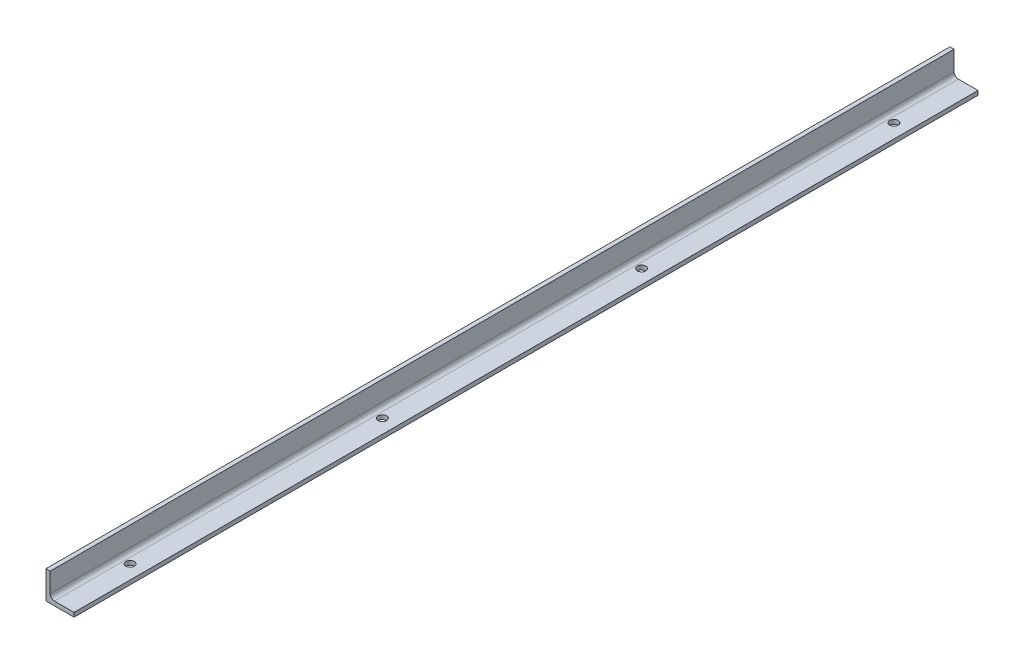
ISO-10303-21;
HEADER;
FILE_DESCRIPTION(('STEP AP214'),'2;1');
FILE_NAME('part.step','',(''),(''),'','','');
FILE_SCHEMA(('AUTOMOTIVE_DESIGN { 1 0 10303 214 1 1 1 1 }'));
ENDSEC;
DATA;
#1=APPLICATION_CONTEXT('core data for automotive mechanical design processes');
#2=APPLICATION_PROTOCOL_DEFINITION('international standard','automotive_design',2000,#1);
#3=PRODUCT_CONTEXT('',#1,'mechanical');
#4=PRODUCT('Part','Part','',(#3));
#5=PRODUCT_RELATED_PRODUCT_CATEGORY('part','',(#4));
#6=PRODUCT_DEFINITION_FORMATION('','',#4);
#7=PRODUCT_DEFINITION_CONTEXT('part definition',#1,'design');
#8=PRODUCT_DEFINITION('design','',#6,#7);
#9=PRODUCT_DEFINITION_SHAPE('','',#8);
#10=(LENGTH_UNIT() NAMED_UNIT(*) SI_UNIT(.MILLI.,.METRE.));
#11=(NAMED_UNIT(*) PLANE_ANGLE_UNIT() SI_UNIT($,.RADIAN.));
#12=(NAMED_UNIT(*) SI_UNIT($,.STERADIAN.) SOLID_ANGLE_UNIT());
#13=UNCERTAINTY_MEASURE_WITH_UNIT(LENGTH_MEASURE(1.E-05),#10,'distance_accuracy_value','');
#14=(GEOMETRIC_REPRESENTATION_CONTEXT(3) GLOBAL_UNCERTAINTY_ASSIGNED_CONTEXT((#13)) GLOBAL_UNIT_ASSIGNED_CONTEXT((#10,
#11,#12)) REPRESENTATION_CONTEXT('',''));
#15=CARTESIAN_POINT('',(0.,0.,0.));
#16=DIRECTION('',(0.,0.,1.));
#17=DIRECTION('',(1.,0.,0.));
#18=AXIS2_PLACEMENT_3D('',#15,#16,#17);
#19=CARTESIAN_POINT('',(20.,0.,645.));
#20=DIRECTION('',(0.,1.,0.));
#21=DIRECTION('',(-1.,0.,0.));
#22=AXIS2_PLACEMENT_3D('',#19,#20,#21);
#23=PLANE('',#22);
#24=CARTESIAN_POINT('',(10.,0.,595.));
#25=DIRECTION('',(0.,-1.,0.));
#26=DIRECTION('',(1.,0.,0.));
#27=AXIS2_PLACEMENT_3D('',#24,#25,#26);
#28=CIRCLE('',#27,3.);
#29=CARTESIAN_POINT('',(13.,0.,595.));
#30=VERTEX_POINT('',#29);
#31=EDGE_CURVE('E152',#30,#30,#28,.T.);
#32=ORIENTED_EDGE('',*,*,#31,.F.);
#33=EDGE_LOOP('',(#32));
#34=FACE_BOUND('',#33,.T.);
#35=CARTESIAN_POINT('',(10.,0.,230.));
#36=DIRECTION('',(0.,-1.,0.));
#37=DIRECTION('',(1.,0.,0.));
#38=AXIS2_PLACEMENT_3D('',#35,#36,#37);
#39=CIRCLE('',#38,3.);
#40=CARTESIAN_POINT('',(13.,0.,230.));
#41=VERTEX_POINT('',#40);
#42=EDGE_CURVE('E208',#41,#41,#39,.T.);
#43=ORIENTED_EDGE('',*,*,#42,.F.);
#44=EDGE_LOOP('',(#43));
#45=FACE_BOUND('',#44,.T.);
#46=CARTESIAN_POINT('',(10.,0.,415.));
#47=DIRECTION('',(0.,-1.,0.));
#48=DIRECTION('',(1.,0.,0.));
#49=AXIS2_PLACEMENT_3D('',#46,#47,#48);
#50=CIRCLE('',#49,3.);
#51=CARTESIAN_POINT('',(13.,0.,415.));
#52=VERTEX_POINT('',#51);
#53=EDGE_CURVE('E165',#52,#52,#50,.T.);
#54=ORIENTED_EDGE('',*,*,#53,.F.);
#55=EDGE_LOOP('',(#54));
#56=FACE_BOUND('',#55,.T.);
#57=CARTESIAN_POINT('',(10.,0.,50.));
#58=DIRECTION('',(0.,-1.,0.));
#59=DIRECTION('',(1.,0.,0.));
#60=AXIS2_PLACEMENT_3D('',#57,#58,#59);
#61=CIRCLE('',#60,3.);
#62=CARTESIAN_POINT('',(13.,0.,50.));
#63=VERTEX_POINT('',#62);
#64=EDGE_CURVE('E148',#63,#63,#61,.T.);
#65=ORIENTED_EDGE('',*,*,#64,.F.);
#66=EDGE_LOOP('',(#65));
#67=FACE_BOUND('',#66,.T.);
#68=DIRECTION('',(1.,0.,0.));
#69=VECTOR('',#68,1.);
#70=CARTESIAN_POINT('',(20.,0.,0.));
#71=LINE('',#70,#69);
#72=CARTESIAN_POINT('',(0.,0.,0.));
#73=VERTEX_POINT('',#72);
#74=CARTESIAN_POINT('',(20.,0.,0.));
#75=VERTEX_POINT('',#74);
#76=EDGE_CURVE('E124',#73,#75,#71,.T.);
#77=ORIENTED_EDGE('',*,*,#76,.T.);
#78=DIRECTION('',(0.,0.,-1.));
#79=VECTOR('',#78,1.);
#80=CARTESIAN_POINT('',(20.,0.,645.));
#81=LINE('',#80,#79);
#82=CARTESIAN_POINT('',(20.,0.,645.));
#83=VERTEX_POINT('',#82);
#84=EDGE_CURVE('E11',#83,#75,#81,.T.);
#85=ORIENTED_EDGE('',*,*,#84,.F.);
#86=DIRECTION('',(1.,0.,0.));
#87=VECTOR('',#86,1.);
#88=CARTESIAN_POINT('',(20.,0.,645.));
#89=LINE('',#88,#87);
#90=CARTESIAN_POINT('',(0.,0.,645.));
#91=VERTEX_POINT('',#90);
#92=EDGE_CURVE('E137',#91,#83,#89,.T.);
#93=ORIENTED_EDGE('',*,*,#92,.F.);
#94=DIRECTION('',(0.,0.,-1.));
#95=VECTOR('',#94,1.);
#96=CARTESIAN_POINT('',(0.,0.,645.));
#97=LINE('',#96,#95);
#98=EDGE_CURVE('E120',#91,#73,#97,.T.);
#99=ORIENTED_EDGE('',*,*,#98,.T.);
#100=EDGE_LOOP('',(#77,#85,#93,#99));
#101=FACE_BOUND('',#100,.T.);
#102=ADVANCED_FACE('F32',(#34,#45,#56,#67,#101),#23,.F.);
#103=CARTESIAN_POINT('',(20.,3.,645.));
#104=DIRECTION('',(-1.,0.,0.));
#105=DIRECTION('',(0.,0.,1.));
#106=AXIS2_PLACEMENT_3D('',#103,#104,#105);
#107=PLANE('',#106);
#108=DIRECTION('',(0.,1.,0.));
#109=VECTOR('',#108,1.);
#110=CARTESIAN_POINT('',(20.,3.,0.));
#111=LINE('',#110,#109);
#112=CARTESIAN_POINT('',(20.,3.,0.));
#113=VERTEX_POINT('',#112);
#114=EDGE_CURVE('E127',#75,#113,#111,.T.);
#115=ORIENTED_EDGE('',*,*,#114,.T.);
#116=DIRECTION('',(0.,0.,-1.));
#117=VECTOR('',#116,1.);
#118=CARTESIAN_POINT('',(20.,3.,645.));
#119=LINE('',#118,#117);
#120=CARTESIAN_POINT('',(20.,3.,645.));
#121=VERTEX_POINT('',#120);
#122=EDGE_CURVE('E41',#121,#113,#119,.T.);
#123=ORIENTED_EDGE('',*,*,#122,.F.);
#124=DIRECTION('',(0.,1.,0.));
#125=VECTOR('',#124,1.);
#126=CARTESIAN_POINT('',(20.,3.,645.));
#127=LINE('',#126,#125);
#128=EDGE_CURVE('E90',#83,#121,#127,.T.);
#129=ORIENTED_EDGE('',*,*,#128,.F.);
#130=ORIENTED_EDGE('',*,*,#84,.T.);
#131=EDGE_LOOP('',(#115,#123,#129,#130));
#132=FACE_BOUND('',#131,.T.);
#133=ADVANCED_FACE('F195',(#132),#107,.F.);
#134=CARTESIAN_POINT('',(6.00000000000002,3.,645.));
#135=DIRECTION('',(0.,-1.,0.));
#136=DIRECTION('',(1.,0.,0.));
#137=AXIS2_PLACEMENT_3D('',#134,#135,#136);
#138=PLANE('',#137);
#139=CARTESIAN_POINT('',(10.,3.,595.));
#140=DIRECTION('',(0.,-1.,0.));
#141=DIRECTION('',(1.,0.,0.));
#142=AXIS2_PLACEMENT_3D('',#139,#140,#141);
#143=CIRCLE('',#142,3.);
#144=CARTESIAN_POINT('',(13.,3.,595.));
#145=VERTEX_POINT('',#144);
#146=EDGE_CURVE('E35',#145,#145,#143,.T.);
#147=ORIENTED_EDGE('',*,*,#146,.T.);
#148=EDGE_LOOP('',(#147));
#149=FACE_BOUND('',#148,.T.);
#150=CARTESIAN_POINT('',(10.,3.,230.));
#151=DIRECTION('',(0.,-1.,0.));
#152=DIRECTION('',(1.,0.,0.));
#153=AXIS2_PLACEMENT_3D('',#150,#151,#152);
#154=CIRCLE('',#153,3.);
#155=CARTESIAN_POINT('',(13.,3.,230.));
#156=VERTEX_POINT('',#155);
#157=EDGE_CURVE('E151',#156,#156,#154,.T.);
#158=ORIENTED_EDGE('',*,*,#157,.T.);
#159=EDGE_LOOP('',(#158));
#160=FACE_BOUND('',#159,.T.);
#161=CARTESIAN_POINT('',(10.,3.,415.));
#162=DIRECTION('',(0.,-1.,0.));
#163=DIRECTION('',(1.,0.,0.));
#164=AXIS2_PLACEMENT_3D('',#161,#162,#163);
#165=CIRCLE('',#164,3.);
#166=CARTESIAN_POINT('',(13.,3.,415.));
#167=VERTEX_POINT('',#166);
#168=EDGE_CURVE('E149',#167,#167,#165,.T.);
#169=ORIENTED_EDGE('',*,*,#168,.T.);
#170=EDGE_LOOP('',(#169));
#171=FACE_BOUND('',#170,.T.);
#172=CARTESIAN_POINT('',(10.,3.,50.));
#173=DIRECTION('',(0.,-1.,0.));
#174=DIRECTION('',(1.,0.,0.));
#175=AXIS2_PLACEMENT_3D('',#172,#173,#174);
#176=CIRCLE('',#175,3.);
#177=CARTESIAN_POINT('',(13.,3.,50.));
#178=VERTEX_POINT('',#177);
#179=EDGE_CURVE('E128',#178,#178,#176,.T.);
#180=ORIENTED_EDGE('',*,*,#179,.T.);
#181=EDGE_LOOP('',(#180));
#182=FACE_BOUND('',#181,.T.);
#183=DIRECTION('',(-1.,0.,0.));
#184=VECTOR('',#183,1.);
#185=CARTESIAN_POINT('',(6.00000000000002,3.,0.));
#186=LINE('',#185,#184);
#187=CARTESIAN_POINT('',(6.00000000000002,3.,0.));
#188=VERTEX_POINT('',#187);
#189=EDGE_CURVE('E130',#113,#188,#186,.T.);
#190=ORIENTED_EDGE('',*,*,#189,.T.);
#191=DIRECTION('',(0.,0.,-1.));
#192=VECTOR('',#191,1.);
#193=CARTESIAN_POINT('',(6.00000000000002,3.,645.));
#194=LINE('',#193,#192);
#195=CARTESIAN_POINT('',(6.00000000000002,3.,645.));
#196=VERTEX_POINT('',#195);
#197=EDGE_CURVE('E141',#196,#188,#194,.T.);
#198=ORIENTED_EDGE('',*,*,#197,.F.);
#199=DIRECTION('',(-1.,0.,0.));
#200=VECTOR('',#199,1.);
#201=CARTESIAN_POINT('',(6.00000000000002,3.,645.));
#202=LINE('',#201,#200);
#203=EDGE_CURVE('E169',#121,#196,#202,.T.);
#204=ORIENTED_EDGE('',*,*,#203,.F.);
#205=ORIENTED_EDGE('',*,*,#122,.T.);
#206=EDGE_LOOP('',(#190,#198,#204,#205));
#207=FACE_BOUND('',#206,.T.);
#208=ADVANCED_FACE('F173',(#149,#160,#171,#182,#207),#138,.F.);
#209=CARTESIAN_POINT('',(6.,6.,645.));
#210=DIRECTION('',(0.,0.,-1.));
#211=DIRECTION('',(-1.,0.,0.));
#212=AXIS2_PLACEMENT_3D('',#209,#210,#211);
#213=CYLINDRICAL_SURFACE('',#212,3.);
#214=CARTESIAN_POINT('',(6.,6.,0.));
#215=DIRECTION('',(0.,0.,-1.));
#216=DIRECTION('',(1.,0.,0.));
#217=AXIS2_PLACEMENT_3D('',#214,#215,#216);
#218=CIRCLE('',#217,3.);
#219=CARTESIAN_POINT('',(3.,6.00000000000002,0.));
#220=VERTEX_POINT('',#219);
#221=EDGE_CURVE('E132',#188,#220,#218,.T.);
#222=ORIENTED_EDGE('',*,*,#221,.T.);
#223=DIRECTION('',(0.,0.,-1.));
#224=VECTOR('',#223,1.);
#225=CARTESIAN_POINT('',(3.,6.00000000000002,645.));
#226=LINE('',#225,#224);
#227=CARTESIAN_POINT('',(3.,6.00000000000002,645.));
#228=VERTEX_POINT('',#227);
#229=EDGE_CURVE('E115',#228,#220,#226,.T.);
#230=ORIENTED_EDGE('',*,*,#229,.F.);
#231=CARTESIAN_POINT('',(6.,6.,645.));
#232=DIRECTION('',(0.,0.,-1.));
#233=DIRECTION('',(1.,0.,0.));
#234=AXIS2_PLACEMENT_3D('',#231,#232,#233);
#235=CIRCLE('',#234,3.);
#236=EDGE_CURVE('E106',#196,#228,#235,.T.);
#237=ORIENTED_EDGE('',*,*,#236,.F.);
#238=ORIENTED_EDGE('',*,*,#197,.T.);
#239=EDGE_LOOP('',(#222,#230,#237,#238));
#240=FACE_BOUND('',#239,.T.);
#241=ADVANCED_FACE('F177',(#240),#213,.F.);
#242=CARTESIAN_POINT('',(3.,20.,645.));
#243=DIRECTION('',(-1.,0.,0.));
#244=DIRECTION('',(0.,-1.,0.));
#245=AXIS2_PLACEMENT_3D('',#242,#243,#244);
#246=PLANE('',#245);
#247=DIRECTION('',(0.,1.,0.));
#248=VECTOR('',#247,1.);
#249=CARTESIAN_POINT('',(3.,20.,0.));
#250=LINE('',#249,#248);
#251=CARTESIAN_POINT('',(3.,20.,0.));
#252=VERTEX_POINT('',#251);
#253=EDGE_CURVE('E114',#220,#252,#250,.T.);
#254=ORIENTED_EDGE('',*,*,#253,.T.);
#255=DIRECTION('',(0.,0.,-1.));
#256=VECTOR('',#255,1.);
#257=CARTESIAN_POINT('',(3.,20.,645.));
#258=LINE('',#257,#256);
#259=CARTESIAN_POINT('',(3.,20.,645.));
#260=VERTEX_POINT('',#259);
#261=EDGE_CURVE('E111',#260,#252,#258,.T.);
#262=ORIENTED_EDGE('',*,*,#261,.F.);
#263=DIRECTION('',(0.,1.,0.));
#264=VECTOR('',#263,1.);
#265=CARTESIAN_POINT('',(3.,20.,645.));
#266=LINE('',#265,#264);
#267=EDGE_CURVE('E100',#228,#260,#266,.T.);
#268=ORIENTED_EDGE('',*,*,#267,.F.);
#269=ORIENTED_EDGE('',*,*,#229,.T.);
#270=EDGE_LOOP('',(#254,#262,#268,#269));
#271=FACE_BOUND('',#270,.T.);
#272=ADVANCED_FACE('F112',(#271),#246,.F.);
#273=CARTESIAN_POINT('',(0.,20.,645.));
#274=DIRECTION('',(0.,-1.,0.));
#275=DIRECTION('',(0.,0.,-1.));
#276=AXIS2_PLACEMENT_3D('',#273,#274,#275);
#277=PLANE('',#276);
#278=DIRECTION('',(-1.,0.,0.));
#279=VECTOR('',#278,1.);
#280=CARTESIAN_POINT('',(0.,20.,0.));
#281=LINE('',#280,#279);
#282=CARTESIAN_POINT('',(0.,20.,0.));
#283=VERTEX_POINT('',#282);
#284=EDGE_CURVE('E76',#252,#283,#281,.T.);
#285=ORIENTED_EDGE('',*,*,#284,.T.);
#286=DIRECTION('',(0.,0.,-1.));
#287=VECTOR('',#286,1.);
#288=CARTESIAN_POINT('',(0.,20.,645.));
#289=LINE('',#288,#287);
#290=CARTESIAN_POINT('',(0.,20.,645.));
#291=VERTEX_POINT('',#290);
#292=EDGE_CURVE('E116',#291,#283,#289,.T.);
#293=ORIENTED_EDGE('',*,*,#292,.F.);
#294=DIRECTION('',(-1.,0.,0.));
#295=VECTOR('',#294,1.);
#296=CARTESIAN_POINT('',(0.,20.,645.));
#297=LINE('',#296,#295);
#298=EDGE_CURVE('E104',#260,#291,#297,.T.);
#299=ORIENTED_EDGE('',*,*,#298,.F.);
#300=ORIENTED_EDGE('',*,*,#261,.T.);
#301=EDGE_LOOP('',(#285,#293,#299,#300));
#302=FACE_BOUND('',#301,.T.);
#303=ADVANCED_FACE('F118',(#302),#277,.F.);
#304=CARTESIAN_POINT('',(0.,0.,645.));
#305=DIRECTION('',(1.,0.,0.));
#306=DIRECTION('',(0.,0.,-1.));
#307=AXIS2_PLACEMENT_3D('',#304,#305,#306);
#308=PLANE('',#307);
#309=DIRECTION('',(0.,-1.,0.));
#310=VECTOR('',#309,1.);
#311=CARTESIAN_POINT('',(0.,0.,0.));
#312=LINE('',#311,#310);
#313=EDGE_CURVE('E82',#283,#73,#312,.T.);
#314=ORIENTED_EDGE('',*,*,#313,.T.);
#315=ORIENTED_EDGE('',*,*,#98,.F.);
#316=DIRECTION('',(0.,-1.,0.));
#317=VECTOR('',#316,1.);
#318=CARTESIAN_POINT('',(0.,0.,645.));
#319=LINE('',#318,#317);
#320=EDGE_CURVE('E50',#291,#91,#319,.T.);
#321=ORIENTED_EDGE('',*,*,#320,.F.);
#322=ORIENTED_EDGE('',*,*,#292,.T.);
#323=EDGE_LOOP('',(#314,#315,#321,#322));
#324=FACE_BOUND('',#323,.T.);
#325=ADVANCED_FACE('F184',(#324),#308,.F.);
#326=CARTESIAN_POINT('',(6.,6.,645.));
#327=DIRECTION('',(0.,0.,1.));
#328=DIRECTION('',(1.,0.,0.));
#329=AXIS2_PLACEMENT_3D('',#326,#327,#328);
#330=PLANE('',#329);
#331=ORIENTED_EDGE('',*,*,#92,.T.);
#332=ORIENTED_EDGE('',*,*,#128,.T.);
#333=ORIENTED_EDGE('',*,*,#203,.T.);
#334=ORIENTED_EDGE('',*,*,#236,.T.);
#335=ORIENTED_EDGE('',*,*,#267,.T.);
#336=ORIENTED_EDGE('',*,*,#298,.T.);
#337=ORIENTED_EDGE('',*,*,#320,.T.);
#338=EDGE_LOOP('',(#331,#332,#333,#334,#335,#336,#337));
#339=FACE_BOUND('',#338,.T.);
#340=ADVANCED_FACE('F102',(#339),#330,.T.);
#341=CARTESIAN_POINT('',(6.,6.,0.));
#342=DIRECTION('',(0.,0.,1.));
#343=DIRECTION('',(1.,0.,0.));
#344=AXIS2_PLACEMENT_3D('',#341,#342,#343);
#345=PLANE('',#344);
#346=ORIENTED_EDGE('',*,*,#76,.F.);
#347=ORIENTED_EDGE('',*,*,#313,.F.);
#348=ORIENTED_EDGE('',*,*,#284,.F.);
#349=ORIENTED_EDGE('',*,*,#253,.F.);
#350=ORIENTED_EDGE('',*,*,#221,.F.);
#351=ORIENTED_EDGE('',*,*,#189,.F.);
#352=ORIENTED_EDGE('',*,*,#114,.F.);
#353=EDGE_LOOP('',(#346,#347,#348,#349,#350,#351,#352));
#354=FACE_BOUND('',#353,.T.);
#355=ADVANCED_FACE('F180',(#354),#345,.F.);
#356=CARTESIAN_POINT('',(9.99999999999999,955.,50.));
#357=DIRECTION('',(0.,-1.,0.));
#358=DIRECTION('',(1.,0.,0.));
#359=AXIS2_PLACEMENT_3D('',#356,#357,#358);
#360=CYLINDRICAL_SURFACE('',#359,3.);
#361=ORIENTED_EDGE('',*,*,#64,.T.);
#362=EDGE_LOOP('',(#361));
#363=FACE_BOUND('',#362,.T.);
#364=ORIENTED_EDGE('',*,*,#179,.F.);
#365=EDGE_LOOP('',(#364));
#366=FACE_BOUND('',#365,.T.);
#367=ADVANCED_FACE('F229',(#363,#366),#360,.F.);
#368=CARTESIAN_POINT('',(9.99999999999999,955.,415.));
#369=DIRECTION('',(0.,-1.,0.));
#370=DIRECTION('',(1.,0.,0.));
#371=AXIS2_PLACEMENT_3D('',#368,#369,#370);
#372=CYLINDRICAL_SURFACE('',#371,3.);
#373=ORIENTED_EDGE('',*,*,#53,.T.);
#374=EDGE_LOOP('',(#373));
#375=FACE_BOUND('',#374,.T.);
#376=ORIENTED_EDGE('',*,*,#168,.F.);
#377=EDGE_LOOP('',(#376));
#378=FACE_BOUND('',#377,.T.);
#379=ADVANCED_FACE('F224',(#375,#378),#372,.F.);
#380=CARTESIAN_POINT('',(9.99999999999999,955.,230.));
#381=DIRECTION('',(0.,-1.,0.));
#382=DIRECTION('',(1.,0.,0.));
#383=AXIS2_PLACEMENT_3D('',#380,#381,#382);
#384=CYLINDRICAL_SURFACE('',#383,3.);
#385=ORIENTED_EDGE('',*,*,#42,.T.);
#386=EDGE_LOOP('',(#385));
#387=FACE_BOUND('',#386,.T.);
#388=ORIENTED_EDGE('',*,*,#157,.F.);
#389=EDGE_LOOP('',(#388));
#390=FACE_BOUND('',#389,.T.);
#391=ADVANCED_FACE('F219',(#387,#390),#384,.F.);
#392=CARTESIAN_POINT('',(9.99999999999999,955.,595.));
#393=DIRECTION('',(0.,-1.,0.));
#394=DIRECTION('',(1.,0.,0.));
#395=AXIS2_PLACEMENT_3D('',#392,#393,#394);
#396=CYLINDRICAL_SURFACE('',#395,3.);
#397=ORIENTED_EDGE('',*,*,#31,.T.);
#398=EDGE_LOOP('',(#397));
#399=FACE_BOUND('',#398,.T.);
#400=ORIENTED_EDGE('',*,*,#146,.F.);
#401=EDGE_LOOP('',(#400));
#402=FACE_BOUND('',#401,.T.);
#403=ADVANCED_FACE('F216',(#399,#402),#396,.F.);
#404=CLOSED_SHELL('',(#102,#133,#208,#241,#272,#303,#325,#340,#355,#367,#379,#391,#403));
#405=MANIFOLD_SOLID_BREP('B2',#404);
#406=ADVANCED_BREP_SHAPE_REPRESENTATION('',(#18,#405),#14);
#407=SHAPE_DEFINITION_REPRESENTATION(#9,#406);
ENDSEC;
END-ISO-10303-21;
